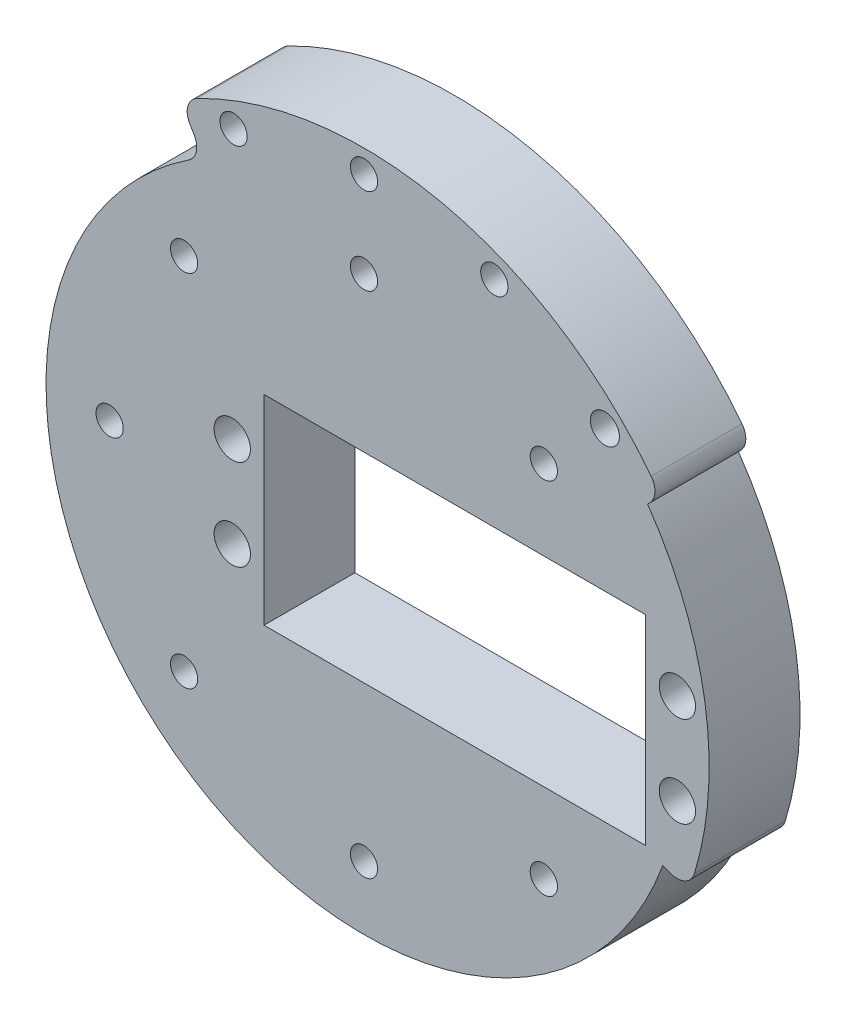
ISO-10303-21;
HEADER;
FILE_DESCRIPTION(('STEP AP214'),'2;1');
FILE_NAME('part.step','',(''),(''),'','','');
FILE_SCHEMA(('AUTOMOTIVE_DESIGN { 1 0 10303 214 1 1 1 1 }'));
ENDSEC;
DATA;
#1=APPLICATION_CONTEXT('core data for automotive mechanical design processes');
#2=APPLICATION_PROTOCOL_DEFINITION('international standard','automotive_design',2000,#1);
#3=PRODUCT_CONTEXT('',#1,'mechanical');
#4=PRODUCT('Part','Part','',(#3));
#5=PRODUCT_RELATED_PRODUCT_CATEGORY('part','',(#4));
#6=PRODUCT_DEFINITION_FORMATION('','',#4);
#7=PRODUCT_DEFINITION_CONTEXT('part definition',#1,'design');
#8=PRODUCT_DEFINITION('design','',#6,#7);
#9=PRODUCT_DEFINITION_SHAPE('','',#8);
#10=(LENGTH_UNIT() NAMED_UNIT(*) SI_UNIT(.MILLI.,.METRE.));
#11=(NAMED_UNIT(*) PLANE_ANGLE_UNIT() SI_UNIT($,.RADIAN.));
#12=(NAMED_UNIT(*) SI_UNIT($,.STERADIAN.) SOLID_ANGLE_UNIT());
#13=UNCERTAINTY_MEASURE_WITH_UNIT(LENGTH_MEASURE(1.E-05),#10,'distance_accuracy_value','');
#14=(GEOMETRIC_REPRESENTATION_CONTEXT(3) GLOBAL_UNCERTAINTY_ASSIGNED_CONTEXT((#13)) GLOBAL_UNIT_ASSIGNED_CONTEXT((#10,
#11,#12)) REPRESENTATION_CONTEXT('',''));
#15=CARTESIAN_POINT('',(0.,0.,0.));
#16=DIRECTION('',(0.,0.,1.));
#17=DIRECTION('',(1.,0.,0.));
#18=AXIS2_PLACEMENT_3D('',#15,#16,#17);
#19=CARTESIAN_POINT('',(0.,11.,10.));
#20=DIRECTION('',(0.,-1.,0.));
#21=DIRECTION('',(0.,0.,-1.));
#22=AXIS2_PLACEMENT_3D('',#19,#20,#21);
#23=PLANE('',#22);
#24=DIRECTION('',(-1.,0.,0.));
#25=VECTOR('',#24,1.);
#26=CARTESIAN_POINT('',(0.,11.,0.));
#27=LINE('',#26,#25);
#28=CARTESIAN_POINT('',(30.9999999999999,11.,0.));
#29=VERTEX_POINT('',#28);
#30=CARTESIAN_POINT('',(-11.,11.,0.));
#31=VERTEX_POINT('',#30);
#32=EDGE_CURVE('E337',#29,#31,#27,.T.);
#33=ORIENTED_EDGE('',*,*,#32,.F.);
#34=DIRECTION('',(0.,0.,-1.));
#35=VECTOR('',#34,1.);
#36=CARTESIAN_POINT('',(30.9999999999999,11.,10.));
#37=LINE('',#36,#35);
#38=CARTESIAN_POINT('',(30.9999999999999,11.,10.));
#39=VERTEX_POINT('',#38);
#40=EDGE_CURVE('E400',#39,#29,#37,.T.);
#41=ORIENTED_EDGE('',*,*,#40,.F.);
#42=DIRECTION('',(-1.,0.,0.));
#43=VECTOR('',#42,1.);
#44=CARTESIAN_POINT('',(0.,11.,10.));
#45=LINE('',#44,#43);
#46=CARTESIAN_POINT('',(-11.,11.,10.));
#47=VERTEX_POINT('',#46);
#48=EDGE_CURVE('E250',#39,#47,#45,.T.);
#49=ORIENTED_EDGE('',*,*,#48,.T.);
#50=DIRECTION('',(0.,0.,-1.));
#51=VECTOR('',#50,1.);
#52=CARTESIAN_POINT('',(-11.,11.,10.));
#53=LINE('',#52,#51);
#54=EDGE_CURVE('E163',#47,#31,#53,.T.);
#55=ORIENTED_EDGE('',*,*,#54,.T.);
#56=EDGE_LOOP('',(#33,#41,#49,#55));
#57=FACE_BOUND('',#56,.T.);
#58=ADVANCED_FACE('F45',(#57),#23,.T.);
#59=CARTESIAN_POINT('',(30.9999999999999,0.,10.));
#60=DIRECTION('',(-1.,0.,0.));
#61=DIRECTION('',(0.,0.,1.));
#62=AXIS2_PLACEMENT_3D('',#59,#60,#61);
#63=PLANE('',#62);
#64=DIRECTION('',(0.,1.,0.));
#65=VECTOR('',#64,1.);
#66=CARTESIAN_POINT('',(30.9999999999999,0.,0.));
#67=LINE('',#66,#65);
#68=CARTESIAN_POINT('',(30.9999999999999,-11.,0.));
#69=VERTEX_POINT('',#68);
#70=EDGE_CURVE('E341',#69,#29,#67,.T.);
#71=ORIENTED_EDGE('',*,*,#70,.F.);
#72=DIRECTION('',(0.,0.,-1.));
#73=VECTOR('',#72,1.);
#74=CARTESIAN_POINT('',(30.9999999999999,-11.,10.));
#75=LINE('',#74,#73);
#76=CARTESIAN_POINT('',(30.9999999999999,-11.,10.));
#77=VERTEX_POINT('',#76);
#78=EDGE_CURVE('E397',#77,#69,#75,.T.);
#79=ORIENTED_EDGE('',*,*,#78,.F.);
#80=DIRECTION('',(0.,1.,0.));
#81=VECTOR('',#80,1.);
#82=CARTESIAN_POINT('',(30.9999999999999,0.,10.));
#83=LINE('',#82,#81);
#84=EDGE_CURVE('E254',#77,#39,#83,.T.);
#85=ORIENTED_EDGE('',*,*,#84,.T.);
#86=ORIENTED_EDGE('',*,*,#40,.T.);
#87=EDGE_LOOP('',(#71,#79,#85,#86));
#88=FACE_BOUND('',#87,.T.);
#89=ADVANCED_FACE('F433',(#88),#63,.T.);
#90=CARTESIAN_POINT('',(0.,-11.,10.));
#91=DIRECTION('',(0.,1.,0.));
#92=DIRECTION('',(0.,0.,1.));
#93=AXIS2_PLACEMENT_3D('',#90,#91,#92);
#94=PLANE('',#93);
#95=DIRECTION('',(1.,0.,0.));
#96=VECTOR('',#95,1.);
#97=CARTESIAN_POINT('',(0.,-11.,0.));
#98=LINE('',#97,#96);
#99=CARTESIAN_POINT('',(-11.,-11.,0.));
#100=VERTEX_POINT('',#99);
#101=EDGE_CURVE('E345',#100,#69,#98,.T.);
#102=ORIENTED_EDGE('',*,*,#101,.F.);
#103=DIRECTION('',(0.,0.,-1.));
#104=VECTOR('',#103,1.);
#105=CARTESIAN_POINT('',(-11.,-11.,10.));
#106=LINE('',#105,#104);
#107=CARTESIAN_POINT('',(-11.,-11.,10.));
#108=VERTEX_POINT('',#107);
#109=EDGE_CURVE('E394',#108,#100,#106,.T.);
#110=ORIENTED_EDGE('',*,*,#109,.F.);
#111=DIRECTION('',(1.,0.,0.));
#112=VECTOR('',#111,1.);
#113=CARTESIAN_POINT('',(0.,-11.,10.));
#114=LINE('',#113,#112);
#115=EDGE_CURVE('E258',#108,#77,#114,.T.);
#116=ORIENTED_EDGE('',*,*,#115,.T.);
#117=ORIENTED_EDGE('',*,*,#78,.T.);
#118=EDGE_LOOP('',(#102,#110,#116,#117));
#119=FACE_BOUND('',#118,.T.);
#120=ADVANCED_FACE('F439',(#119),#94,.T.);
#121=CARTESIAN_POINT('',(0.,0.,10.));
#122=DIRECTION('',(0.,0.,-1.));
#123=DIRECTION('',(-1.,0.,0.));
#124=AXIS2_PLACEMENT_3D('',#121,#122,#123);
#125=CYLINDRICAL_SURFACE('',#124,38.);
#126=CARTESIAN_POINT('',(0.,0.,10.));
#127=DIRECTION('',(0.,0.,1.));
#128=DIRECTION('',(1.,0.,0.));
#129=AXIS2_PLACEMENT_3D('',#126,#127,#128);
#130=CIRCLE('',#129,38.);
#131=CARTESIAN_POINT('',(36.376471092874,-10.9887374538342,10.));
#132=VERTEX_POINT('',#131);
#133=CARTESIAN_POINT('',(31.2142857142856,21.6718335021967,10.));
#134=VERTEX_POINT('',#133);
#135=EDGE_CURVE('E138',#132,#134,#130,.T.);
#136=ORIENTED_EDGE('',*,*,#135,.F.);
#137=DIRECTION('',(0.,0.,-1.));
#138=VECTOR('',#137,1.);
#139=CARTESIAN_POINT('',(36.376471092874,-10.9887374538342,10.));
#140=LINE('',#139,#138);
#141=CARTESIAN_POINT('',(36.376471092874,-10.9887374538342,0.));
#142=VERTEX_POINT('',#141);
#143=EDGE_CURVE('E403',#132,#142,#140,.T.);
#144=ORIENTED_EDGE('',*,*,#143,.T.);
#145=CARTESIAN_POINT('',(0.,0.,0.));
#146=DIRECTION('',(0.,0.,1.));
#147=DIRECTION('',(1.,0.,0.));
#148=AXIS2_PLACEMENT_3D('',#145,#146,#147);
#149=CIRCLE('',#148,38.);
#150=CARTESIAN_POINT('',(31.2142857142856,21.6718335021967,0.));
#151=VERTEX_POINT('',#150);
#152=EDGE_CURVE('E160',#142,#151,#149,.T.);
#153=ORIENTED_EDGE('',*,*,#152,.T.);
#154=DIRECTION('',(0.,0.,-1.));
#155=VECTOR('',#154,1.);
#156=CARTESIAN_POINT('',(31.2142857142856,21.6718335021967,10.));
#157=LINE('',#156,#155);
#158=EDGE_CURVE('E157',#134,#151,#157,.T.);
#159=ORIENTED_EDGE('',*,*,#158,.F.);
#160=EDGE_LOOP('',(#136,#144,#153,#159));
#161=FACE_BOUND('',#160,.T.);
#162=ADVANCED_FACE('F158',(#161),#125,.T.);
#163=CARTESIAN_POINT('',(0.,0.,10.));
#164=DIRECTION('',(0.,0.,-1.));
#165=DIRECTION('',(-1.,0.,0.));
#166=AXIS2_PLACEMENT_3D('',#163,#164,#165);
#167=CYLINDRICAL_SURFACE('',#166,40.);
#168=CARTESIAN_POINT('',(0.,0.,10.));
#169=DIRECTION('',(0.,0.,1.));
#170=DIRECTION('',(1.,0.,0.));
#171=AXIS2_PLACEMENT_3D('',#168,#169,#170);
#172=CIRCLE('',#171,40.);
#173=CARTESIAN_POINT('',(31.6113945648151,24.5095845266209,10.));
#174=VERTEX_POINT('',#173);
#175=CARTESIAN_POINT('',(-18.3805986783743,35.5268010412497,10.));
#176=VERTEX_POINT('',#175);
#177=EDGE_CURVE('E152',#174,#176,#172,.T.);
#178=ORIENTED_EDGE('',*,*,#177,.F.);
#179=DIRECTION('',(0.,0.,-1.));
#180=VECTOR('',#179,1.);
#181=CARTESIAN_POINT('',(31.6113945648151,24.5095845266209,10.));
#182=LINE('',#181,#180);
#183=CARTESIAN_POINT('',(31.6113945648151,24.5095845266209,0.));
#184=VERTEX_POINT('',#183);
#185=EDGE_CURVE('E169',#174,#184,#182,.T.);
#186=ORIENTED_EDGE('',*,*,#185,.T.);
#187=CARTESIAN_POINT('',(0.,0.,0.));
#188=DIRECTION('',(0.,0.,1.));
#189=DIRECTION('',(1.,0.,0.));
#190=AXIS2_PLACEMENT_3D('',#187,#188,#189);
#191=CIRCLE('',#190,40.);
#192=CARTESIAN_POINT('',(-18.3805986783743,35.5268010412497,0.));
#193=VERTEX_POINT('',#192);
#194=EDGE_CURVE('E211',#184,#193,#191,.T.);
#195=ORIENTED_EDGE('',*,*,#194,.T.);
#196=DIRECTION('',(0.,0.,-1.));
#197=VECTOR('',#196,1.);
#198=CARTESIAN_POINT('',(-18.3805986783744,35.5268010412497,10.));
#199=LINE('',#198,#197);
#200=EDGE_CURVE('E174',#193,#176,#199,.F.);
#201=ORIENTED_EDGE('',*,*,#200,.T.);
#202=EDGE_LOOP('',(#178,#186,#195,#201));
#203=FACE_BOUND('',#202,.T.);
#204=ADVANCED_FACE('F424',(#203),#167,.T.);
#205=CARTESIAN_POINT('',(0.,0.,10.));
#206=DIRECTION('',(-0.86275402229154,-0.505623869115936,0.));
#207=DIRECTION('',(0.505623869115936,-0.86275402229154,0.));
#208=AXIS2_PLACEMENT_3D('',#205,#206,#207);
#209=PLANE('',#208);
#210=DIRECTION('',(-0.505623869115936,0.86275402229154,0.));
#211=VECTOR('',#210,1.);
#212=CARTESIAN_POINT('',(0.,0.,0.));
#213=LINE('',#212,#211);
#214=CARTESIAN_POINT('',(-18.6807321438959,31.8752293571045,0.));
#215=VERTEX_POINT('',#214);
#216=CARTESIAN_POINT('',(-19.1870767890387,32.7392132509554,0.));
#217=VERTEX_POINT('',#216);
#218=EDGE_CURVE('E201',#215,#217,#213,.T.);
#219=ORIENTED_EDGE('',*,*,#218,.F.);
#220=DIRECTION('',(0.,0.,-1.));
#221=VECTOR('',#220,1.);
#222=CARTESIAN_POINT('',(-18.6807321438959,31.8752293571045,10.));
#223=LINE('',#222,#221);
#224=CARTESIAN_POINT('',(-18.6807321438959,31.8752293571045,10.));
#225=VERTEX_POINT('',#224);
#226=EDGE_CURVE('E192',#215,#225,#223,.F.);
#227=ORIENTED_EDGE('',*,*,#226,.T.);
#228=DIRECTION('',(-0.505623869115936,0.86275402229154,0.));
#229=VECTOR('',#228,1.);
#230=CARTESIAN_POINT('',(0.,0.,10.));
#231=LINE('',#230,#229);
#232=CARTESIAN_POINT('',(-19.1870767890387,32.7392132509554,10.));
#233=VERTEX_POINT('',#232);
#234=EDGE_CURVE('E222',#225,#233,#231,.T.);
#235=ORIENTED_EDGE('',*,*,#234,.T.);
#236=DIRECTION('',(0.,0.,1.));
#237=VECTOR('',#236,1.);
#238=CARTESIAN_POINT('',(-19.1870767890387,32.7392132509554,0.));
#239=LINE('',#238,#237);
#240=EDGE_CURVE('E188',#233,#217,#239,.F.);
#241=ORIENTED_EDGE('',*,*,#240,.T.);
#242=EDGE_LOOP('',(#219,#227,#235,#241));
#243=FACE_BOUND('',#242,.T.);
#244=ADVANCED_FACE('F208',(#243),#209,.T.);
#245=CARTESIAN_POINT('',(0.,0.,10.));
#246=DIRECTION('',(0.,0.,-1.));
#247=DIRECTION('',(-1.,0.,0.));
#248=AXIS2_PLACEMENT_3D('',#245,#246,#247);
#249=CYLINDRICAL_SURFACE('',#248,35.);
#250=CARTESIAN_POINT('',(0.,0.,10.));
#251=DIRECTION('',(0.,0.,1.));
#252=DIRECTION('',(1.,0.,0.));
#253=AXIS2_PLACEMENT_3D('',#250,#251,#252);
#254=CIRCLE('',#253,35.);
#255=CARTESIAN_POINT('',(-19.3032001782909,29.1956582881227,10.));
#256=VERTEX_POINT('',#255);
#257=CARTESIAN_POINT('',(32.8906105749704,-11.9669434696434,10.));
#258=VERTEX_POINT('',#257);
#259=EDGE_CURVE('E218',#256,#258,#254,.T.);
#260=ORIENTED_EDGE('',*,*,#259,.F.);
#261=DIRECTION('',(0.,0.,-1.));
#262=VECTOR('',#261,1.);
#263=CARTESIAN_POINT('',(-19.3032001782909,29.1956582881227,10.));
#264=LINE('',#263,#262);
#265=CARTESIAN_POINT('',(-19.3032001782909,29.1956582881227,0.));
#266=VERTEX_POINT('',#265);
#267=EDGE_CURVE('E184',#256,#266,#264,.T.);
#268=ORIENTED_EDGE('',*,*,#267,.T.);
#269=CARTESIAN_POINT('',(0.,0.,0.));
#270=DIRECTION('',(0.,0.,1.));
#271=DIRECTION('',(1.,0.,0.));
#272=AXIS2_PLACEMENT_3D('',#269,#270,#271);
#273=CIRCLE('',#272,35.);
#274=CARTESIAN_POINT('',(32.8906105749704,-11.9669434696434,0.));
#275=VERTEX_POINT('',#274);
#276=EDGE_CURVE('E203',#266,#275,#273,.T.);
#277=ORIENTED_EDGE('',*,*,#276,.T.);
#278=DIRECTION('',(0.,0.,-1.));
#279=VECTOR('',#278,1.);
#280=CARTESIAN_POINT('',(32.8906105749704,-11.9669434696434,10.));
#281=LINE('',#280,#279);
#282=EDGE_CURVE('E164',#258,#275,#281,.T.);
#283=ORIENTED_EDGE('',*,*,#282,.F.);
#284=EDGE_LOOP('',(#260,#268,#277,#283));
#285=FACE_BOUND('',#284,.T.);
#286=ADVANCED_FACE('F215',(#285),#249,.T.);
#287=CARTESIAN_POINT('',(-2.22044604925031E-13,-28.,10.));
#288=DIRECTION('',(0.,0.,-1.));
#289=DIRECTION('',(-1.,0.,0.));
#290=AXIS2_PLACEMENT_3D('',#287,#288,#289);
#291=CYLINDRICAL_SURFACE('',#290,1.5);
#292=CARTESIAN_POINT('',(-2.22044604925031E-13,-28.,10.));
#293=DIRECTION('',(0.,0.,1.));
#294=DIRECTION('',(1.,0.,0.));
#295=AXIS2_PLACEMENT_3D('',#292,#293,#294);
#296=CIRCLE('',#295,1.5);
#297=CARTESIAN_POINT('',(1.49999999999978,-28.,10.));
#298=VERTEX_POINT('',#297);
#299=EDGE_CURVE('E298',#298,#298,#296,.T.);
#300=ORIENTED_EDGE('',*,*,#299,.T.);
#301=EDGE_LOOP('',(#300));
#302=FACE_BOUND('',#301,.T.);
#303=CARTESIAN_POINT('',(-2.22044604925031E-13,-28.,0.));
#304=DIRECTION('',(0.,0.,1.));
#305=DIRECTION('',(1.,0.,0.));
#306=AXIS2_PLACEMENT_3D('',#303,#304,#305);
#307=CIRCLE('',#306,1.5);
#308=CARTESIAN_POINT('',(1.49999999999978,-28.,0.));
#309=VERTEX_POINT('',#308);
#310=EDGE_CURVE('E385',#309,#309,#307,.T.);
#311=ORIENTED_EDGE('',*,*,#310,.F.);
#312=EDGE_LOOP('',(#311));
#313=FACE_BOUND('',#312,.T.);
#314=ADVANCED_FACE('F471',(#302,#313),#291,.F.);
#315=CARTESIAN_POINT('',(-19.7989898732235,-19.7989898732232,10.));
#316=DIRECTION('',(0.,0.,-1.));
#317=DIRECTION('',(-1.,0.,0.));
#318=AXIS2_PLACEMENT_3D('',#315,#316,#317);
#319=CYLINDRICAL_SURFACE('',#318,1.5);
#320=CARTESIAN_POINT('',(-19.7989898732235,-19.7989898732232,10.));
#321=DIRECTION('',(0.,0.,1.));
#322=DIRECTION('',(1.,0.,0.));
#323=AXIS2_PLACEMENT_3D('',#320,#321,#322);
#324=CIRCLE('',#323,1.5);
#325=CARTESIAN_POINT('',(-18.2989898732235,-19.7989898732232,10.));
#326=VERTEX_POINT('',#325);
#327=EDGE_CURVE('E294',#326,#326,#324,.T.);
#328=ORIENTED_EDGE('',*,*,#327,.T.);
#329=EDGE_LOOP('',(#328));
#330=FACE_BOUND('',#329,.T.);
#331=CARTESIAN_POINT('',(-19.7989898732235,-19.7989898732232,0.));
#332=DIRECTION('',(0.,0.,1.));
#333=DIRECTION('',(1.,0.,0.));
#334=AXIS2_PLACEMENT_3D('',#331,#332,#333);
#335=CIRCLE('',#334,1.5);
#336=CARTESIAN_POINT('',(-18.2989898732235,-19.7989898732232,0.));
#337=VERTEX_POINT('',#336);
#338=EDGE_CURVE('E381',#337,#337,#335,.T.);
#339=ORIENTED_EDGE('',*,*,#338,.F.);
#340=EDGE_LOOP('',(#339));
#341=FACE_BOUND('',#340,.T.);
#342=ADVANCED_FACE('F627',(#330,#341),#319,.F.);
#343=CARTESIAN_POINT('',(-14.5,-5.,10.));
#344=DIRECTION('',(0.,0.,-1.));
#345=DIRECTION('',(-1.,0.,0.));
#346=AXIS2_PLACEMENT_3D('',#343,#344,#345);
#347=CYLINDRICAL_SURFACE('',#346,2.);
#348=CARTESIAN_POINT('',(-14.5,-5.,10.));
#349=DIRECTION('',(0.,0.,1.));
#350=DIRECTION('',(1.,0.,0.));
#351=AXIS2_PLACEMENT_3D('',#348,#349,#350);
#352=CIRCLE('',#351,2.);
#353=CARTESIAN_POINT('',(-12.5,-5.,10.));
#354=VERTEX_POINT('',#353);
#355=EDGE_CURVE('E290',#354,#354,#352,.T.);
#356=ORIENTED_EDGE('',*,*,#355,.T.);
#357=EDGE_LOOP('',(#356));
#358=FACE_BOUND('',#357,.T.);
#359=CARTESIAN_POINT('',(-14.5,-5.,0.));
#360=DIRECTION('',(0.,0.,1.));
#361=DIRECTION('',(1.,0.,0.));
#362=AXIS2_PLACEMENT_3D('',#359,#360,#361);
#363=CIRCLE('',#362,2.);
#364=CARTESIAN_POINT('',(-12.5,-5.,0.));
#365=VERTEX_POINT('',#364);
#366=EDGE_CURVE('E377',#365,#365,#363,.T.);
#367=ORIENTED_EDGE('',*,*,#366,.F.);
#368=EDGE_LOOP('',(#367));
#369=FACE_BOUND('',#368,.T.);
#370=ADVANCED_FACE('F618',(#358,#369),#347,.F.);
#371=CARTESIAN_POINT('',(0.,28.,10.));
#372=DIRECTION('',(0.,0.,-1.));
#373=DIRECTION('',(-1.,0.,0.));
#374=AXIS2_PLACEMENT_3D('',#371,#372,#373);
#375=CYLINDRICAL_SURFACE('',#374,1.5);
#376=CARTESIAN_POINT('',(0.,28.,10.));
#377=DIRECTION('',(0.,0.,1.));
#378=DIRECTION('',(1.,0.,0.));
#379=AXIS2_PLACEMENT_3D('',#376,#377,#378);
#380=CIRCLE('',#379,1.5);
#381=CARTESIAN_POINT('',(1.5,28.,10.));
#382=VERTEX_POINT('',#381);
#383=EDGE_CURVE('E286',#382,#382,#380,.T.);
#384=ORIENTED_EDGE('',*,*,#383,.T.);
#385=EDGE_LOOP('',(#384));
#386=FACE_BOUND('',#385,.T.);
#387=CARTESIAN_POINT('',(0.,28.,0.));
#388=DIRECTION('',(0.,0.,1.));
#389=DIRECTION('',(1.,0.,0.));
#390=AXIS2_PLACEMENT_3D('',#387,#388,#389);
#391=CIRCLE('',#390,1.5);
#392=CARTESIAN_POINT('',(1.5,28.,0.));
#393=VERTEX_POINT('',#392);
#394=EDGE_CURVE('E373',#393,#393,#391,.T.);
#395=ORIENTED_EDGE('',*,*,#394,.F.);
#396=EDGE_LOOP('',(#395));
#397=FACE_BOUND('',#396,.T.);
#398=ADVANCED_FACE('F609',(#386,#397),#375,.F.);
#399=CARTESIAN_POINT('',(-14.5,5.,10.));
#400=DIRECTION('',(0.,0.,-1.));
#401=DIRECTION('',(-1.,0.,0.));
#402=AXIS2_PLACEMENT_3D('',#399,#400,#401);
#403=CYLINDRICAL_SURFACE('',#402,2.);
#404=CARTESIAN_POINT('',(-14.5,5.,10.));
#405=DIRECTION('',(0.,0.,1.));
#406=DIRECTION('',(1.,0.,0.));
#407=AXIS2_PLACEMENT_3D('',#404,#405,#406);
#408=CIRCLE('',#407,2.);
#409=CARTESIAN_POINT('',(-12.5,5.,10.));
#410=VERTEX_POINT('',#409);
#411=EDGE_CURVE('E282',#410,#410,#408,.T.);
#412=ORIENTED_EDGE('',*,*,#411,.T.);
#413=EDGE_LOOP('',(#412));
#414=FACE_BOUND('',#413,.T.);
#415=CARTESIAN_POINT('',(-14.5,5.,0.));
#416=DIRECTION('',(0.,0.,1.));
#417=DIRECTION('',(1.,0.,0.));
#418=AXIS2_PLACEMENT_3D('',#415,#416,#417);
#419=CIRCLE('',#418,2.);
#420=CARTESIAN_POINT('',(-12.5,5.,0.));
#421=VERTEX_POINT('',#420);
#422=EDGE_CURVE('E369',#421,#421,#419,.T.);
#423=ORIENTED_EDGE('',*,*,#422,.F.);
#424=EDGE_LOOP('',(#423));
#425=FACE_BOUND('',#424,.T.);
#426=ADVANCED_FACE('F600',(#414,#425),#403,.F.);
#427=CARTESIAN_POINT('',(-19.798989873223,19.7989898732236,10.));
#428=DIRECTION('',(0.,0.,-1.));
#429=DIRECTION('',(-1.,0.,0.));
#430=AXIS2_PLACEMENT_3D('',#427,#428,#429);
#431=CYLINDRICAL_SURFACE('',#430,1.5);
#432=CARTESIAN_POINT('',(-19.798989873223,19.7989898732236,10.));
#433=DIRECTION('',(0.,0.,1.));
#434=DIRECTION('',(1.,0.,0.));
#435=AXIS2_PLACEMENT_3D('',#432,#433,#434);
#436=CIRCLE('',#435,1.5);
#437=CARTESIAN_POINT('',(-18.298989873223,19.7989898732236,10.));
#438=VERTEX_POINT('',#437);
#439=EDGE_CURVE('E278',#438,#438,#436,.T.);
#440=ORIENTED_EDGE('',*,*,#439,.T.);
#441=EDGE_LOOP('',(#440));
#442=FACE_BOUND('',#441,.T.);
#443=CARTESIAN_POINT('',(-19.798989873223,19.7989898732236,0.));
#444=DIRECTION('',(0.,0.,1.));
#445=DIRECTION('',(1.,0.,0.));
#446=AXIS2_PLACEMENT_3D('',#443,#444,#445);
#447=CIRCLE('',#446,1.5);
#448=CARTESIAN_POINT('',(-18.298989873223,19.7989898732236,0.));
#449=VERTEX_POINT('',#448);
#450=EDGE_CURVE('E365',#449,#449,#447,.T.);
#451=ORIENTED_EDGE('',*,*,#450,.F.);
#452=EDGE_LOOP('',(#451));
#453=FACE_BOUND('',#452,.T.);
#454=ADVANCED_FACE('F591',(#442,#453),#431,.F.);
#455=CARTESIAN_POINT('',(-28.,2.9316826744008E-13,10.));
#456=DIRECTION('',(0.,0.,-1.));
#457=DIRECTION('',(-1.,0.,0.));
#458=AXIS2_PLACEMENT_3D('',#455,#456,#457);
#459=CYLINDRICAL_SURFACE('',#458,1.5);
#460=CARTESIAN_POINT('',(-28.,2.9316826744008E-13,10.));
#461=DIRECTION('',(0.,0.,1.));
#462=DIRECTION('',(1.,0.,0.));
#463=AXIS2_PLACEMENT_3D('',#460,#461,#462);
#464=CIRCLE('',#463,1.5);
#465=CARTESIAN_POINT('',(-26.5,2.9316826744008E-13,10.));
#466=VERTEX_POINT('',#465);
#467=EDGE_CURVE('E274',#466,#466,#464,.T.);
#468=ORIENTED_EDGE('',*,*,#467,.T.);
#469=EDGE_LOOP('',(#468));
#470=FACE_BOUND('',#469,.T.);
#471=CARTESIAN_POINT('',(-28.,2.9316826744008E-13,0.));
#472=DIRECTION('',(0.,0.,1.));
#473=DIRECTION('',(1.,0.,0.));
#474=AXIS2_PLACEMENT_3D('',#471,#472,#473);
#475=CIRCLE('',#474,1.5);
#476=CARTESIAN_POINT('',(-26.5,2.9316826744008E-13,0.));
#477=VERTEX_POINT('',#476);
#478=EDGE_CURVE('E361',#477,#477,#475,.T.);
#479=ORIENTED_EDGE('',*,*,#478,.F.);
#480=EDGE_LOOP('',(#479));
#481=FACE_BOUND('',#480,.T.);
#482=ADVANCED_FACE('F582',(#470,#481),#459,.F.);
#483=CARTESIAN_POINT('',(19.7989898732234,19.7989898732233,10.));
#484=DIRECTION('',(0.,0.,-1.));
#485=DIRECTION('',(-1.,0.,0.));
#486=AXIS2_PLACEMENT_3D('',#483,#484,#485);
#487=CYLINDRICAL_SURFACE('',#486,1.5);
#488=CARTESIAN_POINT('',(19.7989898732234,19.7989898732233,10.));
#489=DIRECTION('',(0.,0.,1.));
#490=DIRECTION('',(1.,0.,0.));
#491=AXIS2_PLACEMENT_3D('',#488,#489,#490);
#492=CIRCLE('',#491,1.5);
#493=CARTESIAN_POINT('',(21.2989898732234,19.7989898732233,10.));
#494=VERTEX_POINT('',#493);
#495=EDGE_CURVE('E270',#494,#494,#492,.T.);
#496=ORIENTED_EDGE('',*,*,#495,.T.);
#497=EDGE_LOOP('',(#496));
#498=FACE_BOUND('',#497,.T.);
#499=CARTESIAN_POINT('',(19.7989898732234,19.7989898732233,0.));
#500=DIRECTION('',(0.,0.,1.));
#501=DIRECTION('',(1.,0.,0.));
#502=AXIS2_PLACEMENT_3D('',#499,#500,#501);
#503=CIRCLE('',#502,1.5);
#504=CARTESIAN_POINT('',(21.2989898732234,19.7989898732233,0.));
#505=VERTEX_POINT('',#504);
#506=EDGE_CURVE('E357',#505,#505,#503,.T.);
#507=ORIENTED_EDGE('',*,*,#506,.F.);
#508=EDGE_LOOP('',(#507));
#509=FACE_BOUND('',#508,.T.);
#510=ADVANCED_FACE('F573',(#498,#509),#487,.F.);
#511=CARTESIAN_POINT('',(34.5000000000002,-4.99999999999978,10.));
#512=DIRECTION('',(0.,0.,-1.));
#513=DIRECTION('',(-1.,0.,0.));
#514=AXIS2_PLACEMENT_3D('',#511,#512,#513);
#515=CYLINDRICAL_SURFACE('',#514,1.99999999999999);
#516=CARTESIAN_POINT('',(34.5000000000002,-4.99999999999978,10.));
#517=DIRECTION('',(0.,0.,1.));
#518=DIRECTION('',(1.,0.,0.));
#519=AXIS2_PLACEMENT_3D('',#516,#517,#518);
#520=CIRCLE('',#519,1.99999999999999);
#521=CARTESIAN_POINT('',(36.5000000000002,-4.99999999999978,10.));
#522=VERTEX_POINT('',#521);
#523=EDGE_CURVE('E266',#522,#522,#520,.T.);
#524=ORIENTED_EDGE('',*,*,#523,.T.);
#525=EDGE_LOOP('',(#524));
#526=FACE_BOUND('',#525,.T.);
#527=CARTESIAN_POINT('',(34.5000000000002,-4.99999999999978,0.));
#528=DIRECTION('',(0.,0.,1.));
#529=DIRECTION('',(1.,0.,0.));
#530=AXIS2_PLACEMENT_3D('',#527,#528,#529);
#531=CIRCLE('',#530,1.99999999999999);
#532=CARTESIAN_POINT('',(36.5000000000002,-4.99999999999978,0.));
#533=VERTEX_POINT('',#532);
#534=EDGE_CURVE('E353',#533,#533,#531,.T.);
#535=ORIENTED_EDGE('',*,*,#534,.F.);
#536=EDGE_LOOP('',(#535));
#537=FACE_BOUND('',#536,.T.);
#538=ADVANCED_FACE('F564',(#526,#537),#515,.F.);
#539=CARTESIAN_POINT('',(-11.,0.,10.));
#540=DIRECTION('',(1.,0.,0.));
#541=DIRECTION('',(0.,0.,-1.));
#542=AXIS2_PLACEMENT_3D('',#539,#540,#541);
#543=PLANE('',#542);
#544=DIRECTION('',(0.,-1.,0.));
#545=VECTOR('',#544,1.);
#546=CARTESIAN_POINT('',(-11.,0.,0.));
#547=LINE('',#546,#545);
#548=EDGE_CURVE('E349',#31,#100,#547,.T.);
#549=ORIENTED_EDGE('',*,*,#548,.F.);
#550=ORIENTED_EDGE('',*,*,#54,.F.);
#551=DIRECTION('',(0.,-1.,0.));
#552=VECTOR('',#551,1.);
#553=CARTESIAN_POINT('',(-11.,0.,10.));
#554=LINE('',#553,#552);
#555=EDGE_CURVE('E262',#47,#108,#554,.T.);
#556=ORIENTED_EDGE('',*,*,#555,.T.);
#557=ORIENTED_EDGE('',*,*,#109,.T.);
#558=EDGE_LOOP('',(#549,#550,#556,#557));
#559=FACE_BOUND('',#558,.T.);
#560=ADVANCED_FACE('F449',(#559),#543,.T.);
#561=CARTESIAN_POINT('',(34.5,5.00000000000022,10.));
#562=DIRECTION('',(0.,0.,-1.));
#563=DIRECTION('',(-1.,0.,0.));
#564=AXIS2_PLACEMENT_3D('',#561,#562,#563);
#565=CYLINDRICAL_SURFACE('',#564,2.);
#566=CARTESIAN_POINT('',(34.5,5.00000000000022,10.));
#567=DIRECTION('',(0.,0.,1.));
#568=DIRECTION('',(1.,0.,0.));
#569=AXIS2_PLACEMENT_3D('',#566,#567,#568);
#570=CIRCLE('',#569,2.);
#571=CARTESIAN_POINT('',(36.5,5.00000000000022,10.));
#572=VERTEX_POINT('',#571);
#573=EDGE_CURVE('E246',#572,#572,#570,.T.);
#574=ORIENTED_EDGE('',*,*,#573,.T.);
#575=EDGE_LOOP('',(#574));
#576=FACE_BOUND('',#575,.T.);
#577=CARTESIAN_POINT('',(34.5,5.00000000000022,0.));
#578=DIRECTION('',(0.,0.,1.));
#579=DIRECTION('',(1.,0.,0.));
#580=AXIS2_PLACEMENT_3D('',#577,#578,#579);
#581=CIRCLE('',#580,2.);
#582=CARTESIAN_POINT('',(36.5,5.00000000000022,0.));
#583=VERTEX_POINT('',#582);
#584=EDGE_CURVE('E333',#583,#583,#581,.T.);
#585=ORIENTED_EDGE('',*,*,#584,.F.);
#586=EDGE_LOOP('',(#585));
#587=FACE_BOUND('',#586,.T.);
#588=ADVANCED_FACE('F445',(#576,#587),#565,.F.);
#589=CARTESIAN_POINT('',(-14.3506287136909,34.6454824691733,10.));
#590=DIRECTION('',(0.,0.,-1.));
#591=DIRECTION('',(-1.,0.,0.));
#592=AXIS2_PLACEMENT_3D('',#589,#590,#591);
#593=CYLINDRICAL_SURFACE('',#592,1.5);
#594=CARTESIAN_POINT('',(-14.3506287136909,34.6454824691733,10.));
#595=DIRECTION('',(0.,0.,1.));
#596=DIRECTION('',(1.,0.,0.));
#597=AXIS2_PLACEMENT_3D('',#594,#595,#596);
#598=CIRCLE('',#597,1.5);
#599=CARTESIAN_POINT('',(-12.8506287136909,34.6454824691733,10.));
#600=VERTEX_POINT('',#599);
#601=EDGE_CURVE('E242',#600,#600,#598,.T.);
#602=ORIENTED_EDGE('',*,*,#601,.T.);
#603=EDGE_LOOP('',(#602));
#604=FACE_BOUND('',#603,.T.);
#605=CARTESIAN_POINT('',(-14.3506287136909,34.6454824691733,0.));
#606=DIRECTION('',(0.,0.,1.));
#607=DIRECTION('',(1.,0.,0.));
#608=AXIS2_PLACEMENT_3D('',#605,#606,#607);
#609=CIRCLE('',#608,1.5);
#610=CARTESIAN_POINT('',(-12.8506287136909,34.6454824691733,0.));
#611=VERTEX_POINT('',#610);
#612=EDGE_CURVE('E329',#611,#611,#609,.T.);
#613=ORIENTED_EDGE('',*,*,#612,.F.);
#614=EDGE_LOOP('',(#613));
#615=FACE_BOUND('',#614,.T.);
#616=ADVANCED_FACE('F448',(#604,#615),#593,.F.);
#617=CARTESIAN_POINT('',(0.,37.5,10.));
#618=DIRECTION('',(0.,0.,-1.));
#619=DIRECTION('',(-1.,0.,0.));
#620=AXIS2_PLACEMENT_3D('',#617,#618,#619);
#621=CYLINDRICAL_SURFACE('',#620,1.49999999999999);
#622=CARTESIAN_POINT('',(0.,37.5,10.));
#623=DIRECTION('',(0.,0.,1.));
#624=DIRECTION('',(1.,0.,0.));
#625=AXIS2_PLACEMENT_3D('',#622,#623,#624);
#626=CIRCLE('',#625,1.49999999999999);
#627=CARTESIAN_POINT('',(1.49999999999999,37.5,10.));
#628=VERTEX_POINT('',#627);
#629=EDGE_CURVE('E238',#628,#628,#626,.T.);
#630=ORIENTED_EDGE('',*,*,#629,.T.);
#631=EDGE_LOOP('',(#630));
#632=FACE_BOUND('',#631,.T.);
#633=CARTESIAN_POINT('',(0.,37.5,0.));
#634=DIRECTION('',(0.,0.,1.));
#635=DIRECTION('',(1.,0.,0.));
#636=AXIS2_PLACEMENT_3D('',#633,#634,#635);
#637=CIRCLE('',#636,1.49999999999999);
#638=CARTESIAN_POINT('',(1.49999999999999,37.5,0.));
#639=VERTEX_POINT('',#638);
#640=EDGE_CURVE('E325',#639,#639,#637,.T.);
#641=ORIENTED_EDGE('',*,*,#640,.F.);
#642=EDGE_LOOP('',(#641));
#643=FACE_BOUND('',#642,.T.);
#644=ADVANCED_FACE('F453',(#632,#643),#621,.F.);
#645=CARTESIAN_POINT('',(14.3506287136903,34.6454824691735,10.));
#646=DIRECTION('',(0.,0.,-1.));
#647=DIRECTION('',(-1.,0.,0.));
#648=AXIS2_PLACEMENT_3D('',#645,#646,#647);
#649=CYLINDRICAL_SURFACE('',#648,1.5);
#650=CARTESIAN_POINT('',(14.3506287136903,34.6454824691735,10.));
#651=DIRECTION('',(0.,0.,1.));
#652=DIRECTION('',(1.,0.,0.));
#653=AXIS2_PLACEMENT_3D('',#650,#651,#652);
#654=CIRCLE('',#653,1.5);
#655=CARTESIAN_POINT('',(15.8506287136903,34.6454824691735,10.));
#656=VERTEX_POINT('',#655);
#657=EDGE_CURVE('E234',#656,#656,#654,.T.);
#658=ORIENTED_EDGE('',*,*,#657,.T.);
#659=EDGE_LOOP('',(#658));
#660=FACE_BOUND('',#659,.T.);
#661=CARTESIAN_POINT('',(14.3506287136903,34.6454824691735,0.));
#662=DIRECTION('',(0.,0.,1.));
#663=DIRECTION('',(1.,0.,0.));
#664=AXIS2_PLACEMENT_3D('',#661,#662,#663);
#665=CIRCLE('',#664,1.5);
#666=CARTESIAN_POINT('',(15.8506287136903,34.6454824691735,0.));
#667=VERTEX_POINT('',#666);
#668=EDGE_CURVE('E321',#667,#667,#665,.T.);
#669=ORIENTED_EDGE('',*,*,#668,.F.);
#670=EDGE_LOOP('',(#669));
#671=FACE_BOUND('',#670,.T.);
#672=ADVANCED_FACE('F457',(#660,#671),#649,.F.);
#673=CARTESIAN_POINT('',(26.5165042944955,26.5165042944956,10.));
#674=DIRECTION('',(0.,0.,-1.));
#675=DIRECTION('',(-1.,0.,0.));
#676=AXIS2_PLACEMENT_3D('',#673,#674,#675);
#677=CYLINDRICAL_SURFACE('',#676,1.6);
#678=CARTESIAN_POINT('',(26.5165042944955,26.5165042944956,10.));
#679=DIRECTION('',(0.,0.,1.));
#680=DIRECTION('',(1.,0.,0.));
#681=AXIS2_PLACEMENT_3D('',#678,#679,#680);
#682=CIRCLE('',#681,1.6);
#683=CARTESIAN_POINT('',(28.1165042944955,26.5165042944956,10.));
#684=VERTEX_POINT('',#683);
#685=EDGE_CURVE('E226',#684,#684,#682,.T.);
#686=ORIENTED_EDGE('',*,*,#685,.T.);
#687=EDGE_LOOP('',(#686));
#688=FACE_BOUND('',#687,.T.);
#689=CARTESIAN_POINT('',(26.5165042944955,26.5165042944956,0.));
#690=DIRECTION('',(0.,0.,1.));
#691=DIRECTION('',(1.,0.,0.));
#692=AXIS2_PLACEMENT_3D('',#689,#690,#691);
#693=CIRCLE('',#692,1.6);
#694=CARTESIAN_POINT('',(28.1165042944955,26.5165042944956,0.));
#695=VERTEX_POINT('',#694);
#696=EDGE_CURVE('E317',#695,#695,#693,.T.);
#697=ORIENTED_EDGE('',*,*,#696,.F.);
#698=EDGE_LOOP('',(#697));
#699=FACE_BOUND('',#698,.T.);
#700=ADVANCED_FACE('F461',(#688,#699),#677,.F.);
#701=CARTESIAN_POINT('',(0.,0.,10.));
#702=DIRECTION('',(0.341912670561241,0.939731730713442,0.));
#703=DIRECTION('',(-0.939731730713442,0.341912670561241,0.));
#704=AXIS2_PLACEMENT_3D('',#701,#702,#703);
#705=PLANE('',#704);
#706=DIRECTION('',(0.939731730713442,-0.341912670561241,0.));
#707=VECTOR('',#706,1.);
#708=CARTESIAN_POINT('',(0.,0.,0.));
#709=LINE('',#708,#707);
#710=CARTESIAN_POINT('',(33.7780946416003,-12.2898463124277,0.));
#711=VERTEX_POINT('',#710);
#712=EDGE_CURVE('E313',#275,#711,#709,.T.);
#713=ORIENTED_EDGE('',*,*,#712,.T.);
#714=DIRECTION('',(0.,0.,-1.));
#715=VECTOR('',#714,1.);
#716=CARTESIAN_POINT('',(33.7780946416003,-12.2898463124277,10.));
#717=LINE('',#716,#715);
#718=CARTESIAN_POINT('',(33.7780946416003,-12.2898463124277,10.));
#719=VERTEX_POINT('',#718);
#720=EDGE_CURVE('E176',#711,#719,#717,.F.);
#721=ORIENTED_EDGE('',*,*,#720,.T.);
#722=DIRECTION('',(0.939731730713442,-0.341912670561241,0.));
#723=VECTOR('',#722,1.);
#724=CARTESIAN_POINT('',(0.,0.,10.));
#725=LINE('',#724,#723);
#726=EDGE_CURVE('E221',#258,#719,#725,.T.);
#727=ORIENTED_EDGE('',*,*,#726,.F.);
#728=ORIENTED_EDGE('',*,*,#282,.T.);
#729=EDGE_LOOP('',(#713,#721,#727,#728));
#730=FACE_BOUND('',#729,.T.);
#731=ADVANCED_FACE('F419',(#730),#705,.F.);
#732=CARTESIAN_POINT('',(19.7989898732231,-19.7989898732234,10.));
#733=DIRECTION('',(0.,0.,-1.));
#734=DIRECTION('',(-1.,0.,0.));
#735=AXIS2_PLACEMENT_3D('',#732,#733,#734);
#736=CYLINDRICAL_SURFACE('',#735,1.5);
#737=CARTESIAN_POINT('',(19.7989898732231,-19.7989898732234,10.));
#738=DIRECTION('',(0.,0.,1.));
#739=DIRECTION('',(1.,0.,0.));
#740=AXIS2_PLACEMENT_3D('',#737,#738,#739);
#741=CIRCLE('',#740,1.5);
#742=CARTESIAN_POINT('',(21.2989898732231,-19.7989898732234,10.));
#743=VERTEX_POINT('',#742);
#744=EDGE_CURVE('E302',#743,#743,#741,.T.);
#745=ORIENTED_EDGE('',*,*,#744,.T.);
#746=EDGE_LOOP('',(#745));
#747=FACE_BOUND('',#746,.T.);
#748=CARTESIAN_POINT('',(19.7989898732231,-19.7989898732234,0.));
#749=DIRECTION('',(0.,0.,1.));
#750=DIRECTION('',(1.,0.,0.));
#751=AXIS2_PLACEMENT_3D('',#748,#749,#750);
#752=CIRCLE('',#751,1.5);
#753=CARTESIAN_POINT('',(21.2989898732231,-19.7989898732234,0.));
#754=VERTEX_POINT('',#753);
#755=EDGE_CURVE('E153',#754,#754,#752,.T.);
#756=ORIENTED_EDGE('',*,*,#755,.F.);
#757=EDGE_LOOP('',(#756));
#758=FACE_BOUND('',#757,.T.);
#759=ADVANCED_FACE('F468',(#747,#758),#736,.F.);
#760=CARTESIAN_POINT('',(0.,0.,10.));
#761=DIRECTION('',(0.,0.,1.));
#762=DIRECTION('',(1.,0.,0.));
#763=AXIS2_PLACEMENT_3D('',#760,#761,#762);
#764=PLANE('',#763);
#765=ORIENTED_EDGE('',*,*,#726,.T.);
#766=CARTESIAN_POINT('',(34.4619199827228,-10.4103828510008,10.));
#767=DIRECTION('',(0.,0.,1.));
#768=DIRECTION('',(1.,0.,0.));
#769=AXIS2_PLACEMENT_3D('',#766,#767,#768);
#770=CIRCLE('',#769,2.);
#771=EDGE_CURVE('E147',#719,#132,#770,.T.);
#772=ORIENTED_EDGE('',*,*,#771,.T.);
#773=ORIENTED_EDGE('',*,*,#135,.T.);
#774=CARTESIAN_POINT('',(30.0308248365744,23.2841053002899,10.));
#775=DIRECTION('',(0.,0.,1.));
#776=DIRECTION('',(1.,0.,0.));
#777=AXIS2_PLACEMENT_3D('',#774,#775,#776);
#778=CIRCLE('',#777,2.);
#779=EDGE_CURVE('E144',#134,#174,#778,.T.);
#780=ORIENTED_EDGE('',*,*,#779,.T.);
#781=ORIENTED_EDGE('',*,*,#177,.T.);
#782=CARTESIAN_POINT('',(-17.4615687444556,33.7504609891872,10.));
#783=DIRECTION('',(0.,0.,1.));
#784=DIRECTION('',(1.,0.,0.));
#785=AXIS2_PLACEMENT_3D('',#782,#783,#784);
#786=CIRCLE('',#785,2.);
#787=EDGE_CURVE('E65',#176,#233,#786,.T.);
#788=ORIENTED_EDGE('',*,*,#787,.T.);
#789=ORIENTED_EDGE('',*,*,#234,.F.);
#790=CARTESIAN_POINT('',(-20.406240188479,30.8639816188726,10.));
#791=DIRECTION('',(0.,0.,1.));
#792=DIRECTION('',(1.,0.,0.));
#793=AXIS2_PLACEMENT_3D('',#790,#791,#792);
#794=CIRCLE('',#793,2.);
#795=EDGE_CURVE('E11',#225,#256,#794,.F.);
#796=ORIENTED_EDGE('',*,*,#795,.T.);
#797=ORIENTED_EDGE('',*,*,#259,.T.);
#798=EDGE_LOOP('',(#765,#772,#773,#780,#781,#788,#789,#796,#797));
#799=FACE_BOUND('',#798,.T.);
#800=ORIENTED_EDGE('',*,*,#685,.F.);
#801=EDGE_LOOP('',(#800));
#802=FACE_BOUND('',#801,.T.);
#803=ORIENTED_EDGE('',*,*,#657,.F.);
#804=EDGE_LOOP('',(#803));
#805=FACE_BOUND('',#804,.T.);
#806=ORIENTED_EDGE('',*,*,#629,.F.);
#807=EDGE_LOOP('',(#806));
#808=FACE_BOUND('',#807,.T.);
#809=ORIENTED_EDGE('',*,*,#601,.F.);
#810=EDGE_LOOP('',(#809));
#811=FACE_BOUND('',#810,.T.);
#812=ORIENTED_EDGE('',*,*,#573,.F.);
#813=EDGE_LOOP('',(#812));
#814=FACE_BOUND('',#813,.T.);
#815=ORIENTED_EDGE('',*,*,#48,.F.);
#816=ORIENTED_EDGE('',*,*,#84,.F.);
#817=ORIENTED_EDGE('',*,*,#115,.F.);
#818=ORIENTED_EDGE('',*,*,#555,.F.);
#819=EDGE_LOOP('',(#815,#816,#817,#818));
#820=FACE_BOUND('',#819,.T.);
#821=ORIENTED_EDGE('',*,*,#523,.F.);
#822=EDGE_LOOP('',(#821));
#823=FACE_BOUND('',#822,.T.);
#824=ORIENTED_EDGE('',*,*,#495,.F.);
#825=EDGE_LOOP('',(#824));
#826=FACE_BOUND('',#825,.T.);
#827=ORIENTED_EDGE('',*,*,#467,.F.);
#828=EDGE_LOOP('',(#827));
#829=FACE_BOUND('',#828,.T.);
#830=ORIENTED_EDGE('',*,*,#439,.F.);
#831=EDGE_LOOP('',(#830));
#832=FACE_BOUND('',#831,.T.);
#833=ORIENTED_EDGE('',*,*,#411,.F.);
#834=EDGE_LOOP('',(#833));
#835=FACE_BOUND('',#834,.T.);
#836=ORIENTED_EDGE('',*,*,#383,.F.);
#837=EDGE_LOOP('',(#836));
#838=FACE_BOUND('',#837,.T.);
#839=ORIENTED_EDGE('',*,*,#355,.F.);
#840=EDGE_LOOP('',(#839));
#841=FACE_BOUND('',#840,.T.);
#842=ORIENTED_EDGE('',*,*,#327,.F.);
#843=EDGE_LOOP('',(#842));
#844=FACE_BOUND('',#843,.T.);
#845=ORIENTED_EDGE('',*,*,#299,.F.);
#846=EDGE_LOOP('',(#845));
#847=FACE_BOUND('',#846,.T.);
#848=ORIENTED_EDGE('',*,*,#744,.F.);
#849=EDGE_LOOP('',(#848));
#850=FACE_BOUND('',#849,.T.);
#851=ADVANCED_FACE('F141',(#799,#802,#805,#808,#811,#814,#820,#823,#826,#829,#832,#835,#838,
#841,#844,#847,#850),#764,.T.);
#852=CARTESIAN_POINT('',(0.,0.,0.));
#853=DIRECTION('',(0.,0.,1.));
#854=DIRECTION('',(1.,0.,0.));
#855=AXIS2_PLACEMENT_3D('',#852,#853,#854);
#856=PLANE('',#855);
#857=ORIENTED_EDGE('',*,*,#152,.F.);
#858=CARTESIAN_POINT('',(34.4619199827228,-10.4103828510008,0.));
#859=DIRECTION('',(0.,0.,1.));
#860=DIRECTION('',(1.,0.,0.));
#861=AXIS2_PLACEMENT_3D('',#858,#859,#860);
#862=CIRCLE('',#861,2.);
#863=EDGE_CURVE('E414',#142,#711,#862,.F.);
#864=ORIENTED_EDGE('',*,*,#863,.T.);
#865=ORIENTED_EDGE('',*,*,#712,.F.);
#866=ORIENTED_EDGE('',*,*,#276,.F.);
#867=CARTESIAN_POINT('',(-20.406240188479,30.8639816188726,0.));
#868=DIRECTION('',(0.,0.,1.));
#869=DIRECTION('',(1.,0.,0.));
#870=AXIS2_PLACEMENT_3D('',#867,#868,#869);
#871=CIRCLE('',#870,2.);
#872=EDGE_CURVE('E54',#266,#215,#871,.T.);
#873=ORIENTED_EDGE('',*,*,#872,.T.);
#874=ORIENTED_EDGE('',*,*,#218,.T.);
#875=CARTESIAN_POINT('',(-17.4615687444556,33.7504609891872,0.));
#876=DIRECTION('',(0.,0.,1.));
#877=DIRECTION('',(1.,0.,0.));
#878=AXIS2_PLACEMENT_3D('',#875,#876,#877);
#879=CIRCLE('',#878,2.);
#880=EDGE_CURVE('E408',#217,#193,#879,.F.);
#881=ORIENTED_EDGE('',*,*,#880,.T.);
#882=ORIENTED_EDGE('',*,*,#194,.F.);
#883=CARTESIAN_POINT('',(30.0308248365744,23.2841053002899,0.));
#884=DIRECTION('',(0.,0.,1.));
#885=DIRECTION('',(1.,0.,0.));
#886=AXIS2_PLACEMENT_3D('',#883,#884,#885);
#887=CIRCLE('',#886,2.);
#888=EDGE_CURVE('E411',#184,#151,#887,.F.);
#889=ORIENTED_EDGE('',*,*,#888,.T.);
#890=EDGE_LOOP('',(#857,#864,#865,#866,#873,#874,#881,#882,#889));
#891=FACE_BOUND('',#890,.T.);
#892=ORIENTED_EDGE('',*,*,#696,.T.);
#893=EDGE_LOOP('',(#892));
#894=FACE_BOUND('',#893,.T.);
#895=ORIENTED_EDGE('',*,*,#668,.T.);
#896=EDGE_LOOP('',(#895));
#897=FACE_BOUND('',#896,.T.);
#898=ORIENTED_EDGE('',*,*,#640,.T.);
#899=EDGE_LOOP('',(#898));
#900=FACE_BOUND('',#899,.T.);
#901=ORIENTED_EDGE('',*,*,#612,.T.);
#902=EDGE_LOOP('',(#901));
#903=FACE_BOUND('',#902,.T.);
#904=ORIENTED_EDGE('',*,*,#584,.T.);
#905=EDGE_LOOP('',(#904));
#906=FACE_BOUND('',#905,.T.);
#907=ORIENTED_EDGE('',*,*,#32,.T.);
#908=ORIENTED_EDGE('',*,*,#548,.T.);
#909=ORIENTED_EDGE('',*,*,#101,.T.);
#910=ORIENTED_EDGE('',*,*,#70,.T.);
#911=EDGE_LOOP('',(#907,#908,#909,#910));
#912=FACE_BOUND('',#911,.T.);
#913=ORIENTED_EDGE('',*,*,#534,.T.);
#914=EDGE_LOOP('',(#913));
#915=FACE_BOUND('',#914,.T.);
#916=ORIENTED_EDGE('',*,*,#506,.T.);
#917=EDGE_LOOP('',(#916));
#918=FACE_BOUND('',#917,.T.);
#919=ORIENTED_EDGE('',*,*,#478,.T.);
#920=EDGE_LOOP('',(#919));
#921=FACE_BOUND('',#920,.T.);
#922=ORIENTED_EDGE('',*,*,#450,.T.);
#923=EDGE_LOOP('',(#922));
#924=FACE_BOUND('',#923,.T.);
#925=ORIENTED_EDGE('',*,*,#422,.T.);
#926=EDGE_LOOP('',(#925));
#927=FACE_BOUND('',#926,.T.);
#928=ORIENTED_EDGE('',*,*,#394,.T.);
#929=EDGE_LOOP('',(#928));
#930=FACE_BOUND('',#929,.T.);
#931=ORIENTED_EDGE('',*,*,#366,.T.);
#932=EDGE_LOOP('',(#931));
#933=FACE_BOUND('',#932,.T.);
#934=ORIENTED_EDGE('',*,*,#338,.T.);
#935=EDGE_LOOP('',(#934));
#936=FACE_BOUND('',#935,.T.);
#937=ORIENTED_EDGE('',*,*,#310,.T.);
#938=EDGE_LOOP('',(#937));
#939=FACE_BOUND('',#938,.T.);
#940=ORIENTED_EDGE('',*,*,#755,.T.);
#941=EDGE_LOOP('',(#940));
#942=FACE_BOUND('',#941,.T.);
#943=ADVANCED_FACE('F199',(#891,#894,#897,#900,#903,#906,#912,#915,#918,#921,#924,#927,#930,
#933,#936,#939,#942),#856,.F.);
#944=CARTESIAN_POINT('',(34.4619199827228,-10.4103828510008,10.));
#945=DIRECTION('',(0.,0.,-1.));
#946=DIRECTION('',(-1.,0.,0.));
#947=AXIS2_PLACEMENT_3D('',#944,#945,#946);
#948=CYLINDRICAL_SURFACE('',#947,2.);
#949=ORIENTED_EDGE('',*,*,#771,.F.);
#950=ORIENTED_EDGE('',*,*,#720,.F.);
#951=ORIENTED_EDGE('',*,*,#863,.F.);
#952=ORIENTED_EDGE('',*,*,#143,.F.);
#953=EDGE_LOOP('',(#949,#950,#951,#952));
#954=FACE_BOUND('',#953,.T.);
#955=ADVANCED_FACE('F421',(#954),#948,.T.);
#956=CARTESIAN_POINT('',(30.0308248365744,23.2841053002899,10.));
#957=DIRECTION('',(0.,0.,1.));
#958=DIRECTION('',(1.,0.,0.));
#959=AXIS2_PLACEMENT_3D('',#956,#957,#958);
#960=CYLINDRICAL_SURFACE('',#959,2.);
#961=ORIENTED_EDGE('',*,*,#779,.F.);
#962=ORIENTED_EDGE('',*,*,#158,.T.);
#963=ORIENTED_EDGE('',*,*,#888,.F.);
#964=ORIENTED_EDGE('',*,*,#185,.F.);
#965=EDGE_LOOP('',(#961,#962,#963,#964));
#966=FACE_BOUND('',#965,.T.);
#967=ADVANCED_FACE('F167',(#966),#960,.T.);
#968=CARTESIAN_POINT('',(-20.406240188479,30.8639816188726,10.));
#969=DIRECTION('',(0.,0.,-1.));
#970=DIRECTION('',(-1.,0.,0.));
#971=AXIS2_PLACEMENT_3D('',#968,#969,#970);
#972=CYLINDRICAL_SURFACE('',#971,2.);
#973=ORIENTED_EDGE('',*,*,#795,.F.);
#974=ORIENTED_EDGE('',*,*,#226,.F.);
#975=ORIENTED_EDGE('',*,*,#872,.F.);
#976=ORIENTED_EDGE('',*,*,#267,.F.);
#977=EDGE_LOOP('',(#973,#974,#975,#976));
#978=FACE_BOUND('',#977,.T.);
#979=ADVANCED_FACE('F213',(#978),#972,.F.);
#980=CARTESIAN_POINT('',(-17.4615687444556,33.7504609891872,10.));
#981=DIRECTION('',(0.,0.,-1.));
#982=DIRECTION('',(-1.,0.,0.));
#983=AXIS2_PLACEMENT_3D('',#980,#981,#982);
#984=CYLINDRICAL_SURFACE('',#983,2.);
#985=ORIENTED_EDGE('',*,*,#787,.F.);
#986=ORIENTED_EDGE('',*,*,#200,.F.);
#987=ORIENTED_EDGE('',*,*,#880,.F.);
#988=ORIENTED_EDGE('',*,*,#240,.F.);
#989=EDGE_LOOP('',(#985,#986,#987,#988));
#990=FACE_BOUND('',#989,.T.);
#991=ADVANCED_FACE('F47',(#990),#984,.T.);
#992=CLOSED_SHELL('',(#58,#89,#120,#162,#204,#244,#286,#314,#342,#370,#398,#426,#454,#482,#510,
#538,#560,#588,#616,#644,#672,#700,#731,#759,#851,#943,#955,#967,#979,#991));
#993=MANIFOLD_SOLID_BREP('B2',#992);
#994=ADVANCED_BREP_SHAPE_REPRESENTATION('',(#18,#993),#14);
#995=SHAPE_DEFINITION_REPRESENTATION(#9,#994);
ENDSEC;
END-ISO-10303-21;
